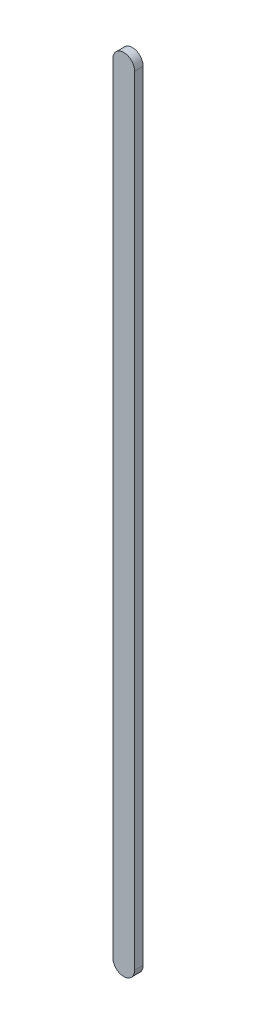
ISO-10303-21;
HEADER;
FILE_DESCRIPTION(('STEP AP214'),'2;1');
FILE_NAME('part.step','',(''),(''),'','','');
FILE_SCHEMA(('AUTOMOTIVE_DESIGN { 1 0 10303 214 1 1 1 1 }'));
ENDSEC;
DATA;
#1=APPLICATION_CONTEXT('core data for automotive mechanical design processes');
#2=APPLICATION_PROTOCOL_DEFINITION('international standard','automotive_design',2000,#1);
#3=PRODUCT_CONTEXT('',#1,'mechanical');
#4=PRODUCT('Part','Part','',(#3));
#5=PRODUCT_RELATED_PRODUCT_CATEGORY('part','',(#4));
#6=PRODUCT_DEFINITION_FORMATION('','',#4);
#7=PRODUCT_DEFINITION_CONTEXT('part definition',#1,'design');
#8=PRODUCT_DEFINITION('design','',#6,#7);
#9=PRODUCT_DEFINITION_SHAPE('','',#8);
#10=(LENGTH_UNIT() NAMED_UNIT(*) SI_UNIT(.MILLI.,.METRE.));
#11=(NAMED_UNIT(*) PLANE_ANGLE_UNIT() SI_UNIT($,.RADIAN.));
#12=(NAMED_UNIT(*) SI_UNIT($,.STERADIAN.) SOLID_ANGLE_UNIT());
#13=UNCERTAINTY_MEASURE_WITH_UNIT(LENGTH_MEASURE(1.E-05),#10,'distance_accuracy_value','');
#14=(GEOMETRIC_REPRESENTATION_CONTEXT(3) GLOBAL_UNCERTAINTY_ASSIGNED_CONTEXT((#13)) GLOBAL_UNIT_ASSIGNED_CONTEXT((#10,
#11,#12)) REPRESENTATION_CONTEXT('',''));
#15=CARTESIAN_POINT('',(0.,0.,0.));
#16=DIRECTION('',(0.,0.,1.));
#17=DIRECTION('',(1.,0.,0.));
#18=AXIS2_PLACEMENT_3D('',#15,#16,#17);
#19=CARTESIAN_POINT('',(87.503,78.2066,0.));
#20=DIRECTION('',(-1.,0.,0.));
#21=DIRECTION('',(0.,1.,0.));
#22=AXIS2_PLACEMENT_3D('',#19,#20,#21);
#23=PLANE('',#22);
#24=DIRECTION('',(0.,1.,0.));
#25=VECTOR('',#24,1.);
#26=CARTESIAN_POINT('',(87.503,78.2066,0.1999996));
#27=LINE('',#26,#25);
#28=CARTESIAN_POINT('',(87.503,78.2066,0.1999996));
#29=VERTEX_POINT('',#28);
#30=CARTESIAN_POINT('',(87.503,96.393,0.1999996));
#31=VERTEX_POINT('',#30);
#32=EDGE_CURVE('E11',#29,#31,#27,.T.);
#33=ORIENTED_EDGE('',*,*,#32,.F.);
#34=DIRECTION('',(0.,0.,1.));
#35=VECTOR('',#34,1.);
#36=CARTESIAN_POINT('',(87.503,78.2066,0.));
#37=LINE('',#36,#35);
#38=CARTESIAN_POINT('',(87.503,78.2066,0.));
#39=VERTEX_POINT('',#38);
#40=EDGE_CURVE('E24',#39,#29,#37,.T.);
#41=ORIENTED_EDGE('',*,*,#40,.F.);
#42=DIRECTION('',(0.,1.,0.));
#43=VECTOR('',#42,1.);
#44=CARTESIAN_POINT('',(87.503,78.2066,0.));
#45=LINE('',#44,#43);
#46=CARTESIAN_POINT('',(87.503,96.393,0.));
#47=VERTEX_POINT('',#46);
#48=EDGE_CURVE('E75',#39,#47,#45,.T.);
#49=ORIENTED_EDGE('',*,*,#48,.T.);
#50=DIRECTION('',(0.,0.,1.));
#51=VECTOR('',#50,1.);
#52=CARTESIAN_POINT('',(87.503,96.393,0.));
#53=LINE('',#52,#51);
#54=EDGE_CURVE('E37',#47,#31,#53,.T.);
#55=ORIENTED_EDGE('',*,*,#54,.T.);
#56=EDGE_LOOP('',(#33,#41,#49,#55));
#57=FACE_BOUND('',#56,.T.);
#58=ADVANCED_FACE('F17',(#57),#23,.F.);
#59=CARTESIAN_POINT('',(87.249,96.393,0.));
#60=DIRECTION('',(0.,0.,-1.));
#61=DIRECTION('',(1.,0.,0.));
#62=AXIS2_PLACEMENT_3D('',#59,#60,#61);
#63=CYLINDRICAL_SURFACE('',#62,0.253999999999995);
#64=CARTESIAN_POINT('',(87.249,96.393,0.1999996));
#65=DIRECTION('',(0.,0.,1.));
#66=DIRECTION('',(1.,0.,0.));
#67=AXIS2_PLACEMENT_3D('',#64,#65,#66);
#68=CIRCLE('',#67,0.253999999999995);
#69=CARTESIAN_POINT('',(86.995,96.393,0.1999996));
#70=VERTEX_POINT('',#69);
#71=EDGE_CURVE('E83',#31,#70,#68,.T.);
#72=ORIENTED_EDGE('',*,*,#71,.F.);
#73=ORIENTED_EDGE('',*,*,#54,.F.);
#74=CARTESIAN_POINT('',(87.249,96.393,0.));
#75=DIRECTION('',(0.,0.,1.));
#76=DIRECTION('',(1.,0.,0.));
#77=AXIS2_PLACEMENT_3D('',#74,#75,#76);
#78=CIRCLE('',#77,0.253999999999995);
#79=CARTESIAN_POINT('',(86.995,96.393,0.));
#80=VERTEX_POINT('',#79);
#81=EDGE_CURVE('E81',#47,#80,#78,.T.);
#82=ORIENTED_EDGE('',*,*,#81,.T.);
#83=DIRECTION('',(0.,0.,1.));
#84=VECTOR('',#83,1.);
#85=CARTESIAN_POINT('',(86.995,96.393,0.));
#86=LINE('',#85,#84);
#87=EDGE_CURVE('E67',#80,#70,#86,.T.);
#88=ORIENTED_EDGE('',*,*,#87,.T.);
#89=EDGE_LOOP('',(#72,#73,#82,#88));
#90=FACE_BOUND('',#89,.T.);
#91=ADVANCED_FACE('F89',(#90),#63,.T.);
#92=CARTESIAN_POINT('',(86.995,96.393,0.));
#93=DIRECTION('',(1.,0.,0.));
#94=DIRECTION('',(0.,-1.,0.));
#95=AXIS2_PLACEMENT_3D('',#92,#93,#94);
#96=PLANE('',#95);
#97=DIRECTION('',(0.,-1.,0.));
#98=VECTOR('',#97,1.);
#99=CARTESIAN_POINT('',(86.995,96.393,0.1999996));
#100=LINE('',#99,#98);
#101=CARTESIAN_POINT('',(86.995,78.2066,0.1999996));
#102=VERTEX_POINT('',#101);
#103=EDGE_CURVE('E71',#70,#102,#100,.T.);
#104=ORIENTED_EDGE('',*,*,#103,.F.);
#105=ORIENTED_EDGE('',*,*,#87,.F.);
#106=DIRECTION('',(0.,-1.,0.));
#107=VECTOR('',#106,1.);
#108=CARTESIAN_POINT('',(86.995,96.393,0.));
#109=LINE('',#108,#107);
#110=CARTESIAN_POINT('',(86.995,78.2066,0.));
#111=VERTEX_POINT('',#110);
#112=EDGE_CURVE('E63',#80,#111,#109,.T.);
#113=ORIENTED_EDGE('',*,*,#112,.T.);
#114=DIRECTION('',(0.,0.,1.));
#115=VECTOR('',#114,1.);
#116=CARTESIAN_POINT('',(86.995,78.2066,0.));
#117=LINE('',#116,#115);
#118=EDGE_CURVE('E53',#111,#102,#117,.T.);
#119=ORIENTED_EDGE('',*,*,#118,.T.);
#120=EDGE_LOOP('',(#104,#105,#113,#119));
#121=FACE_BOUND('',#120,.T.);
#122=ADVANCED_FACE('F66',(#121),#96,.F.);
#123=CARTESIAN_POINT('',(87.249,78.2066,0.));
#124=DIRECTION('',(0.,0.,-1.));
#125=DIRECTION('',(-1.,0.,0.));
#126=AXIS2_PLACEMENT_3D('',#123,#124,#125);
#127=CYLINDRICAL_SURFACE('',#126,0.254);
#128=CARTESIAN_POINT('',(87.249,78.2066,0.1999996));
#129=DIRECTION('',(0.,0.,1.));
#130=DIRECTION('',(-1.,0.,0.));
#131=AXIS2_PLACEMENT_3D('',#128,#129,#130);
#132=CIRCLE('',#131,0.254);
#133=EDGE_CURVE('E59',#102,#29,#132,.T.);
#134=ORIENTED_EDGE('',*,*,#133,.F.);
#135=ORIENTED_EDGE('',*,*,#118,.F.);
#136=CARTESIAN_POINT('',(87.249,78.2066,0.));
#137=DIRECTION('',(0.,0.,1.));
#138=DIRECTION('',(-1.,0.,0.));
#139=AXIS2_PLACEMENT_3D('',#136,#137,#138);
#140=CIRCLE('',#139,0.254);
#141=EDGE_CURVE('E57',#111,#39,#140,.T.);
#142=ORIENTED_EDGE('',*,*,#141,.T.);
#143=ORIENTED_EDGE('',*,*,#40,.T.);
#144=EDGE_LOOP('',(#134,#135,#142,#143));
#145=FACE_BOUND('',#144,.T.);
#146=ADVANCED_FACE('F55',(#145),#127,.T.);
#147=CARTESIAN_POINT('',(87.503,78.2066,0.));
#148=DIRECTION('',(0.,0.,-1.));
#149=DIRECTION('',(-1.,0.,0.));
#150=AXIS2_PLACEMENT_3D('',#147,#148,#149);
#151=PLANE('',#150);
#152=ORIENTED_EDGE('',*,*,#141,.F.);
#153=ORIENTED_EDGE('',*,*,#112,.F.);
#154=ORIENTED_EDGE('',*,*,#81,.F.);
#155=ORIENTED_EDGE('',*,*,#48,.F.);
#156=EDGE_LOOP('',(#152,#153,#154,#155));
#157=FACE_BOUND('',#156,.T.);
#158=ADVANCED_FACE('F74',(#157),#151,.T.);
#159=CARTESIAN_POINT('',(87.503,78.2066,0.1999996));
#160=DIRECTION('',(0.,0.,-1.));
#161=DIRECTION('',(-1.,0.,0.));
#162=AXIS2_PLACEMENT_3D('',#159,#160,#161);
#163=PLANE('',#162);
#164=ORIENTED_EDGE('',*,*,#32,.T.);
#165=ORIENTED_EDGE('',*,*,#71,.T.);
#166=ORIENTED_EDGE('',*,*,#103,.T.);
#167=ORIENTED_EDGE('',*,*,#133,.T.);
#168=EDGE_LOOP('',(#164,#165,#166,#167));
#169=FACE_BOUND('',#168,.T.);
#170=ADVANCED_FACE('F91',(#169),#163,.F.);
#171=CLOSED_SHELL('',(#58,#91,#122,#146,#158,#170));
#172=MANIFOLD_SOLID_BREP('B1',#171);
#173=ADVANCED_BREP_SHAPE_REPRESENTATION('',(#18,#172),#14);
#174=SHAPE_DEFINITION_REPRESENTATION(#9,#173);
ENDSEC;
END-ISO-10303-21;
